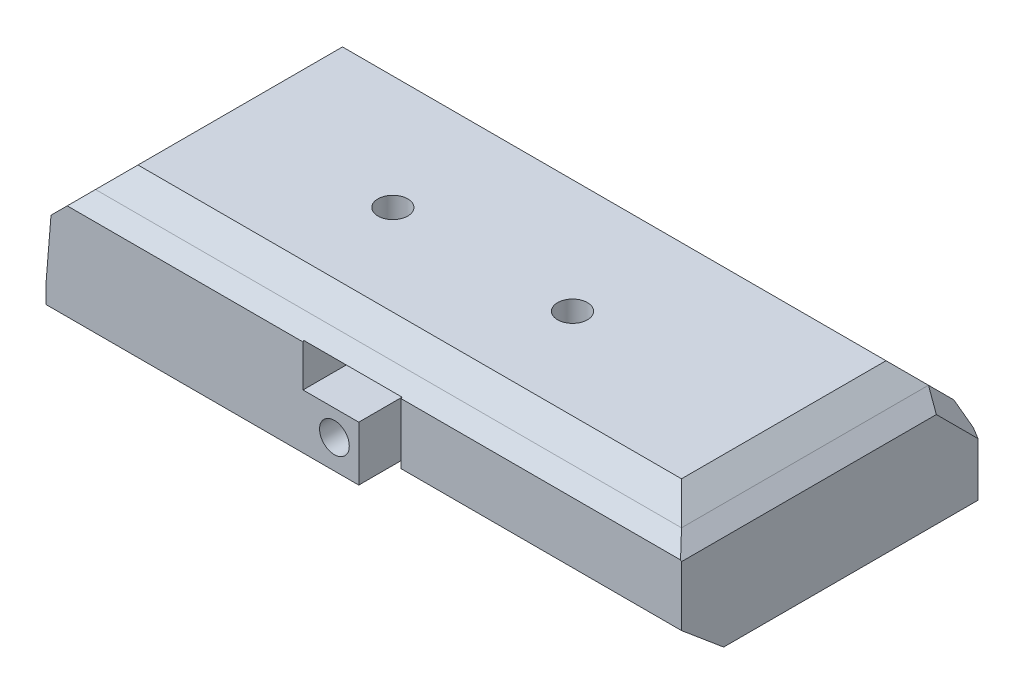
ISO-10303-21;
HEADER;
FILE_DESCRIPTION(('STEP AP214'),'2;1');
FILE_NAME('part.step','',(''),(''),'','','');
FILE_SCHEMA(('AUTOMOTIVE_DESIGN { 1 0 10303 214 1 1 1 1 }'));
ENDSEC;
DATA;
#1=APPLICATION_CONTEXT('core data for automotive mechanical design processes');
#2=APPLICATION_PROTOCOL_DEFINITION('international standard','automotive_design',2000,#1);
#3=PRODUCT_CONTEXT('',#1,'mechanical');
#4=PRODUCT('Part','Part','',(#3));
#5=PRODUCT_RELATED_PRODUCT_CATEGORY('part','',(#4));
#6=PRODUCT_DEFINITION_FORMATION('','',#4);
#7=PRODUCT_DEFINITION_CONTEXT('part definition',#1,'design');
#8=PRODUCT_DEFINITION('design','',#6,#7);
#9=PRODUCT_DEFINITION_SHAPE('','',#8);
#10=(LENGTH_UNIT() NAMED_UNIT(*) SI_UNIT(.MILLI.,.METRE.));
#11=(NAMED_UNIT(*) PLANE_ANGLE_UNIT() SI_UNIT($,.RADIAN.));
#12=(NAMED_UNIT(*) SI_UNIT($,.STERADIAN.) SOLID_ANGLE_UNIT());
#13=UNCERTAINTY_MEASURE_WITH_UNIT(LENGTH_MEASURE(1.E-05),#10,'distance_accuracy_value','');
#14=(GEOMETRIC_REPRESENTATION_CONTEXT(3) GLOBAL_UNCERTAINTY_ASSIGNED_CONTEXT((#13)) GLOBAL_UNIT_ASSIGNED_CONTEXT((#10,
#11,#12)) REPRESENTATION_CONTEXT('',''));
#15=CARTESIAN_POINT('',(0.,0.,0.));
#16=DIRECTION('',(0.,0.,1.));
#17=DIRECTION('',(1.,0.,0.));
#18=AXIS2_PLACEMENT_3D('',#15,#16,#17);
#19=CARTESIAN_POINT('',(-5.23271255306533,8.20599999999992,10.3226904858506));
#20=DIRECTION('',(0.,0.,-1.));
#21=DIRECTION('',(-1.,0.,0.));
#22=AXIS2_PLACEMENT_3D('',#19,#20,#21);
#23=PLANE('',#22);
#24=DIRECTION('',(-1.,0.,0.));
#25=VECTOR('',#24,1.);
#26=CARTESIAN_POINT('',(-0.232712553065327,13.5826195303939,10.3226904858506));
#27=LINE('',#26,#25);
#28=CARTESIAN_POINT('',(84.461180425117,13.5826195303939,10.3226904858506));
#29=VERTEX_POINT('',#28);
#30=CARTESIAN_POINT('',(44.97731631751,13.5826195303939,10.3226904858506));
#31=VERTEX_POINT('',#30);
#32=EDGE_CURVE('E273',#29,#31,#27,.T.);
#33=ORIENTED_EDGE('',*,*,#32,.T.);
#34=DIRECTION('',(0.,1.,0.));
#35=VECTOR('',#34,1.);
#36=CARTESIAN_POINT('',(44.97731631751,13.7059999999999,10.3226904858506));
#37=LINE('',#36,#35);
#38=CARTESIAN_POINT('',(44.97731631751,4.99999999999989,10.3226904858506));
#39=VERTEX_POINT('',#38);
#40=EDGE_CURVE('E438',#39,#31,#37,.T.);
#41=ORIENTED_EDGE('',*,*,#40,.F.);
#42=DIRECTION('',(1.,0.,0.));
#43=VECTOR('',#42,1.);
#44=CARTESIAN_POINT('',(-5.23271255306533,4.99999999999989,10.3226904858506));
#45=LINE('',#44,#43);
#46=CARTESIAN_POINT('',(84.5961502528417,4.99999999999989,10.3226904858506));
#47=VERTEX_POINT('',#46);
#48=EDGE_CURVE('E264',#39,#47,#45,.T.);
#49=ORIENTED_EDGE('',*,*,#48,.T.);
#50=DIRECTION('',(0.,-1.,0.));
#51=VECTOR('',#50,1.);
#52=CARTESIAN_POINT('',(84.5961502528417,15.5826195303939,10.3226904858506));
#53=LINE('',#52,#51);
#54=CARTESIAN_POINT('',(84.5961502528417,13.4378821103445,10.3226904858506));
#55=VERTEX_POINT('',#54);
#56=EDGE_CURVE('E367',#55,#47,#53,.T.);
#57=ORIENTED_EDGE('',*,*,#56,.F.);
#58=DIRECTION('',(-0.681998360062499,0.73135370161917,0.));
#59=VECTOR('',#58,1.);
#60=CARTESIAN_POINT('',(84.5961502528417,13.4378821103445,10.3226904858506));
#61=LINE('',#60,#59);
#62=EDGE_CURVE('E304',#55,#29,#61,.T.);
#63=ORIENTED_EDGE('',*,*,#62,.T.);
#64=EDGE_LOOP('',(#33,#41,#49,#57,#63));
#65=FACE_BOUND('',#64,.T.);
#66=ADVANCED_FACE('F43',(#65),#23,.F.);
#67=CARTESIAN_POINT('',(-0.232712553065326,15.5826195303939,0.));
#68=DIRECTION('',(-0.707106781186549,0.707106781186547,0.));
#69=DIRECTION('',(0.,0.,-1.));
#70=AXIS2_PLACEMENT_3D('',#67,#68,#69);
#71=PLANE('',#70);
#72=DIRECTION('',(-0.707106781186547,-0.707106781186549,0.));
#73=VECTOR('',#72,1.);
#74=CARTESIAN_POINT('',(-0.232712553065326,15.5826195303939,10.3226904858506));
#75=LINE('',#74,#73);
#76=CARTESIAN_POINT('',(-2.23271255306532,13.5826195303939,10.3226904858506));
#77=VERTEX_POINT('',#76);
#78=CARTESIAN_POINT('',(-4.52560577187878,11.2897263115804,10.3226904858506));
#79=VERTEX_POINT('',#78);
#80=EDGE_CURVE('E207',#77,#79,#75,.T.);
#81=ORIENTED_EDGE('',*,*,#80,.F.);
#82=DIRECTION('',(0.577350269189625,0.577350269189626,-0.577350269189626));
#83=VECTOR('',#82,1.);
#84=CARTESIAN_POINT('',(2.54151760888489,18.3568496923441,5.54846032390043));
#85=LINE('',#84,#83);
#86=CARTESIAN_POINT('',(-0.232712553065326,15.5826195303939,8.32269048585064));
#87=VERTEX_POINT('',#86);
#88=EDGE_CURVE('E204',#77,#87,#85,.T.);
#89=ORIENTED_EDGE('',*,*,#88,.T.);
#90=DIRECTION('',(0.,0.,1.));
#91=VECTOR('',#90,1.);
#92=CARTESIAN_POINT('',(-0.232712553065326,15.5826195303939,10.3226904858506));
#93=LINE('',#92,#91);
#94=CARTESIAN_POINT('',(-0.232712553065327,15.5826195303939,-26.5873095141492));
#95=VERTEX_POINT('',#94);
#96=EDGE_CURVE('E197',#95,#87,#93,.T.);
#97=ORIENTED_EDGE('',*,*,#96,.F.);
#98=DIRECTION('',(0.577350269189623,0.577350269189624,0.57735026918963));
#99=VECTOR('',#98,1.);
#100=CARTESIAN_POINT('',(-0.155141702043552,15.6601903814157,-26.5097386631275));
#101=LINE('',#100,#99);
#102=CARTESIAN_POINT('',(-2.55714017870718,13.2581919047521,-28.9117371397911));
#103=VERTEX_POINT('',#102);
#104=EDGE_CURVE('E202',#103,#95,#101,.T.);
#105=ORIENTED_EDGE('',*,*,#104,.F.);
#106=DIRECTION('',(0.681235920666489,0.681235920666491,0.268020970797735));
#107=VECTOR('',#106,1.);
#108=CARTESIAN_POINT('',(4.87917598034183,20.6945080638011,-25.9860419207879));
#109=LINE('',#108,#107);
#110=CARTESIAN_POINT('',(-5.23271255306533,10.5826195303939,-29.9643967008335));
#111=VERTEX_POINT('',#110);
#112=EDGE_CURVE('E220',#111,#103,#109,.T.);
#113=ORIENTED_EDGE('',*,*,#112,.F.);
#114=DIRECTION('',(0.,0.,-1.));
#115=VECTOR('',#114,1.);
#116=CARTESIAN_POINT('',(-5.23271255306533,10.5826195303939,-26.5873095141492));
#117=LINE('',#116,#115);
#118=CARTESIAN_POINT('',(-5.23271255306531,10.5826195303939,-0.677309514149018));
#119=VERTEX_POINT('',#118);
#120=EDGE_CURVE('E333',#119,#111,#117,.T.);
#121=ORIENTED_EDGE('',*,*,#120,.F.);
#122=DIRECTION('',(0.0640184399664479,0.0640184399664481,0.995893206467704));
#123=VECTOR('',#122,1.);
#124=CARTESIAN_POINT('',(-5.14854671983099,10.6667853636282,0.632003577183369));
#125=LINE('',#124,#123);
#126=EDGE_CURVE('E321',#119,#79,#125,.T.);
#127=ORIENTED_EDGE('',*,*,#126,.T.);
#128=EDGE_LOOP('',(#81,#89,#97,#105,#113,#121,#127));
#129=FACE_BOUND('',#128,.T.);
#130=ADVANCED_FACE('F200',(#129),#71,.T.);
#131=CARTESIAN_POINT('',(-5.23271255306533,8.20599999999992,-31.5873095141493));
#132=DIRECTION('',(1.,0.,0.));
#133=DIRECTION('',(0.,0.,-1.));
#134=AXIS2_PLACEMENT_3D('',#131,#132,#133);
#135=PLANE('',#134);
#136=DIRECTION('',(0.,-0.588171697675046,0.808736084303189));
#137=VECTOR('',#136,1.);
#138=CARTESIAN_POINT('',(-5.23271255306533,24.4635727739333,-19.763620224016));
#139=LINE('',#138,#137);
#140=CARTESIAN_POINT('',(-5.23271255306533,2.5826195303939,10.3226904858506));
#141=VERTEX_POINT('',#140);
#142=EDGE_CURVE('E219',#119,#141,#139,.T.);
#143=ORIENTED_EDGE('',*,*,#142,.F.);
#144=ORIENTED_EDGE('',*,*,#120,.T.);
#145=DIRECTION('',(0.,-0.879548109367855,-0.475809965540268));
#146=VECTOR('',#145,1.);
#147=CARTESIAN_POINT('',(-5.23271255306533,8.06486970171601,-31.3264261867285));
#148=LINE('',#147,#146);
#149=CARTESIAN_POINT('',(-5.23271255306533,7.58261953039386,-31.5873095141493));
#150=VERTEX_POINT('',#149);
#151=EDGE_CURVE('E340',#111,#150,#148,.T.);
#152=ORIENTED_EDGE('',*,*,#151,.T.);
#153=DIRECTION('',(0.,-1.,0.));
#154=VECTOR('',#153,1.);
#155=CARTESIAN_POINT('',(-5.23271255306533,8.20599999999992,-31.5873095141493));
#156=LINE('',#155,#154);
#157=CARTESIAN_POINT('',(-5.23271255306533,0.,-31.5873095141493));
#158=VERTEX_POINT('',#157);
#159=EDGE_CURVE('E227',#150,#158,#156,.T.);
#160=ORIENTED_EDGE('',*,*,#159,.T.);
#161=DIRECTION('',(0.,0.,1.));
#162=VECTOR('',#161,1.);
#163=CARTESIAN_POINT('',(-5.23271255306533,0.,-31.5873095141493));
#164=LINE('',#163,#162);
#165=CARTESIAN_POINT('',(-5.23271255306533,0.,10.3226904858506));
#166=VERTEX_POINT('',#165);
#167=EDGE_CURVE('E356',#158,#166,#164,.T.);
#168=ORIENTED_EDGE('',*,*,#167,.T.);
#169=DIRECTION('',(0.,-1.,0.));
#170=VECTOR('',#169,1.);
#171=CARTESIAN_POINT('',(-5.23271255306533,8.20599999999992,10.3226904858506));
#172=LINE('',#171,#170);
#173=EDGE_CURVE('E353',#141,#166,#172,.T.);
#174=ORIENTED_EDGE('',*,*,#173,.F.);
#175=EDGE_LOOP('',(#143,#144,#152,#160,#168,#174));
#176=FACE_BOUND('',#175,.T.);
#177=ADVANCED_FACE('F497',(#176),#135,.F.);
#178=CARTESIAN_POINT('',(39.47731631751,8.20599999999992,-31.5873095141493));
#179=DIRECTION('',(0.,0.,1.));
#180=DIRECTION('',(1.,0.,0.));
#181=AXIS2_PLACEMENT_3D('',#178,#179,#180);
#182=PLANE('',#181);
#183=DIRECTION('',(1.,0.,0.));
#184=VECTOR('',#183,1.);
#185=CARTESIAN_POINT('',(84.5961502528417,10.5826195303939,-31.5873095141493));
#186=LINE('',#185,#184);
#187=CARTESIAN_POINT('',(5.76728744693472,10.5826195303939,-31.5873095141493));
#188=VERTEX_POINT('',#187);
#189=CARTESIAN_POINT('',(31.0961502528417,10.5826195303939,-31.5873095141493));
#190=VERTEX_POINT('',#189);
#191=EDGE_CURVE('E226',#188,#190,#186,.T.);
#192=ORIENTED_EDGE('',*,*,#191,.T.);
#193=DIRECTION('',(0.,-1.,0.));
#194=VECTOR('',#193,1.);
#195=CARTESIAN_POINT('',(31.0961502528417,13.7059999999999,-31.5873095141493));
#196=LINE('',#195,#194);
#197=CARTESIAN_POINT('',(31.0961502528417,7.70599999999992,-31.5873095141493));
#198=VERTEX_POINT('',#197);
#199=EDGE_CURVE('E416',#190,#198,#196,.T.);
#200=ORIENTED_EDGE('',*,*,#199,.T.);
#201=DIRECTION('',(1.,0.,0.));
#202=VECTOR('',#201,1.);
#203=CARTESIAN_POINT('',(31.0961502528417,7.70599999999992,-31.5873095141493));
#204=LINE('',#203,#202);
#205=CARTESIAN_POINT('',(38.9773163175099,7.70599999999992,-31.5873095141493));
#206=VERTEX_POINT('',#205);
#207=EDGE_CURVE('E437',#198,#206,#204,.T.);
#208=ORIENTED_EDGE('',*,*,#207,.T.);
#209=DIRECTION('',(0.,-1.,0.));
#210=VECTOR('',#209,1.);
#211=CARTESIAN_POINT('',(38.9773163175099,7.70599999999992,-31.5873095141493));
#212=LINE('',#211,#210);
#213=CARTESIAN_POINT('',(38.9773163175099,0.,-31.5873095141493));
#214=VERTEX_POINT('',#213);
#215=EDGE_CURVE('E456',#206,#214,#212,.T.);
#216=ORIENTED_EDGE('',*,*,#215,.T.);
#217=DIRECTION('',(-1.,0.,0.));
#218=VECTOR('',#217,1.);
#219=CARTESIAN_POINT('',(39.47731631751,0.,-31.5873095141493));
#220=LINE('',#219,#218);
#221=EDGE_CURVE('E360',#214,#158,#220,.T.);
#222=ORIENTED_EDGE('',*,*,#221,.T.);
#223=ORIENTED_EDGE('',*,*,#159,.F.);
#224=DIRECTION('',(0.964763821237732,0.263117405792109,0.));
#225=VECTOR('',#224,1.);
#226=CARTESIAN_POINT('',(36.5402493610624,18.9752455069742,-31.5873095141493));
#227=LINE('',#226,#225);
#228=EDGE_CURVE('E343',#150,#188,#227,.T.);
#229=ORIENTED_EDGE('',*,*,#228,.T.);
#230=EDGE_LOOP('',(#192,#200,#208,#216,#222,#223,#229));
#231=FACE_BOUND('',#230,.T.);
#232=CARTESIAN_POINT('',(35.5367332851758,4.10299999999993,-31.5873095141493));
#233=DIRECTION('',(0.,0.,1.));
#234=DIRECTION('',(1.,0.,0.));
#235=AXIS2_PLACEMENT_3D('',#232,#233,#234);
#236=CIRCLE('',#235,2.1);
#237=CARTESIAN_POINT('',(37.6367332851758,4.10299999999993,-31.5873095141493));
#238=VERTEX_POINT('',#237);
#239=EDGE_CURVE('E300',#238,#238,#236,.T.);
#240=ORIENTED_EDGE('',*,*,#239,.T.);
#241=EDGE_LOOP('',(#240));
#242=FACE_BOUND('',#241,.T.);
#243=ADVANCED_FACE('F503',(#231,#242),#182,.F.);
#244=CARTESIAN_POINT('',(35.5367332851758,4.10299999999993,10.3226904858506));
#245=DIRECTION('',(0.,0.,1.));
#246=DIRECTION('',(1.,0.,0.));
#247=AXIS2_PLACEMENT_3D('',#244,#245,#246);
#248=CIRCLE('',#247,2.1);
#249=CARTESIAN_POINT('',(37.6367332851758,4.10299999999993,10.3226904858506));
#250=VERTEX_POINT('',#249);
#251=EDGE_CURVE('E392',#250,#250,#248,.T.);
#252=ORIENTED_EDGE('',*,*,#251,.F.);
#253=EDGE_LOOP('',(#252));
#254=FACE_BOUND('',#253,.T.);
#255=DIRECTION('',(1.,0.,0.));
#256=VECTOR('',#255,1.);
#257=CARTESIAN_POINT('',(31.5961502528417,7.70599999999992,10.3226904858506));
#258=LINE('',#257,#256);
#259=CARTESIAN_POINT('',(31.0961502528417,7.70599999999992,10.3226904858506));
#260=VERTEX_POINT('',#259);
#261=CARTESIAN_POINT('',(38.9773163175099,7.70599999999992,10.3226904858506));
#262=VERTEX_POINT('',#261);
#263=EDGE_CURVE('E444',#260,#262,#258,.T.);
#264=ORIENTED_EDGE('',*,*,#263,.F.);
#265=DIRECTION('',(0.,-1.,0.));
#266=VECTOR('',#265,1.);
#267=CARTESIAN_POINT('',(31.0961502528417,13.2059999999999,10.3226904858506));
#268=LINE('',#267,#266);
#269=CARTESIAN_POINT('',(31.0961502528417,13.5826195303939,10.3226904858506));
#270=VERTEX_POINT('',#269);
#271=EDGE_CURVE('E434',#270,#260,#268,.T.);
#272=ORIENTED_EDGE('',*,*,#271,.F.);
#273=EDGE_CURVE('E277',#270,#77,#27,.T.);
#274=ORIENTED_EDGE('',*,*,#273,.T.);
#275=ORIENTED_EDGE('',*,*,#80,.T.);
#276=DIRECTION('',(0.0809438249334175,0.996718665022958,0.));
#277=VECTOR('',#276,1.);
#278=CARTESIAN_POINT('',(-4.77902822004321,8.16915615778459,10.3226904858506));
#279=LINE('',#278,#277);
#280=EDGE_CURVE('E325',#141,#79,#279,.T.);
#281=ORIENTED_EDGE('',*,*,#280,.F.);
#282=ORIENTED_EDGE('',*,*,#173,.T.);
#283=DIRECTION('',(1.,0.,0.));
#284=VECTOR('',#283,1.);
#285=CARTESIAN_POINT('',(-5.23271255306533,0.,10.3226904858506));
#286=LINE('',#285,#284);
#287=CARTESIAN_POINT('',(38.9773163175099,0.,10.3226904858506));
#288=VERTEX_POINT('',#287);
#289=EDGE_CURVE('E363',#166,#288,#286,.T.);
#290=ORIENTED_EDGE('',*,*,#289,.T.);
#291=DIRECTION('',(0.,-1.,0.));
#292=VECTOR('',#291,1.);
#293=CARTESIAN_POINT('',(38.9773163175099,7.70599999999992,10.3226904858506));
#294=LINE('',#293,#292);
#295=EDGE_CURVE('E441',#262,#288,#294,.T.);
#296=ORIENTED_EDGE('',*,*,#295,.F.);
#297=EDGE_LOOP('',(#264,#272,#274,#275,#281,#282,#290,#296));
#298=FACE_BOUND('',#297,.T.);
#299=ADVANCED_FACE('F493',(#254,#298),#23,.F.);
#300=DIRECTION('',(1.,0.,0.));
#301=VECTOR('',#300,1.);
#302=CARTESIAN_POINT('',(84.5961502528417,-1.14491749414469E-13,-31.5873095141493));
#303=LINE('',#302,#301);
#304=CARTESIAN_POINT('',(44.97731631751,-1.14491749414469E-13,-31.5873095141493));
#305=VERTEX_POINT('',#304);
#306=CARTESIAN_POINT('',(84.5961502528417,-1.14491749414469E-13,-31.5873095141493));
#307=VERTEX_POINT('',#306);
#308=EDGE_CURVE('E375',#305,#307,#303,.T.);
#309=ORIENTED_EDGE('',*,*,#308,.F.);
#310=DIRECTION('',(0.,1.,0.));
#311=VECTOR('',#310,1.);
#312=CARTESIAN_POINT('',(44.97731631751,13.5826195303939,-31.5873095141493));
#313=LINE('',#312,#311);
#314=CARTESIAN_POINT('',(44.97731631751,8.58261953039384,-31.5873095141493));
#315=VERTEX_POINT('',#314);
#316=EDGE_CURVE('E452',#305,#315,#313,.T.);
#317=ORIENTED_EDGE('',*,*,#316,.T.);
#318=DIRECTION('',(1.,0.,0.));
#319=VECTOR('',#318,1.);
#320=CARTESIAN_POINT('',(82.5961502528417,8.58261953039384,-31.5873095141493));
#321=LINE('',#320,#319);
#322=CARTESIAN_POINT('',(83.9149257347751,8.58261953039385,-31.5873095141493));
#323=VERTEX_POINT('',#322);
#324=EDGE_CURVE('E292',#315,#323,#321,.T.);
#325=ORIENTED_EDGE('',*,*,#324,.T.);
#326=DIRECTION('',(0.550486111273608,-0.834844321592272,0.));
#327=VECTOR('',#326,1.);
#328=CARTESIAN_POINT('',(79.072620379973,15.9262582636572,-31.5873095141493));
#329=LINE('',#328,#327);
#330=CARTESIAN_POINT('',(84.5961502528417,7.54950278323098,-31.5873095141493));
#331=VERTEX_POINT('',#330);
#332=EDGE_CURVE('E308',#323,#331,#329,.T.);
#333=ORIENTED_EDGE('',*,*,#332,.T.);
#334=DIRECTION('',(0.,1.,0.));
#335=VECTOR('',#334,1.);
#336=CARTESIAN_POINT('',(84.5961502528417,15.5826195303939,-31.5873095141493));
#337=LINE('',#336,#335);
#338=EDGE_CURVE('E371',#307,#331,#337,.T.);
#339=ORIENTED_EDGE('',*,*,#338,.F.);
#340=EDGE_LOOP('',(#309,#317,#325,#333,#339));
#341=FACE_BOUND('',#340,.T.);
#342=ADVANCED_FACE('F502',(#341),#182,.F.);
#343=CARTESIAN_POINT('',(0.,0.,0.));
#344=DIRECTION('',(0.,-1.,0.));
#345=DIRECTION('',(0.,0.,-1.));
#346=AXIS2_PLACEMENT_3D('',#343,#344,#345);
#347=PLANE('',#346);
#348=DIRECTION('',(0.,0.,1.));
#349=VECTOR('',#348,1.);
#350=CARTESIAN_POINT('',(38.9773163175099,0.,-31.5873095141493));
#351=LINE('',#350,#349);
#352=EDGE_CURVE('E415',#214,#288,#351,.T.);
#353=ORIENTED_EDGE('',*,*,#352,.T.);
#354=ORIENTED_EDGE('',*,*,#289,.F.);
#355=ORIENTED_EDGE('',*,*,#167,.F.);
#356=ORIENTED_EDGE('',*,*,#221,.F.);
#357=EDGE_LOOP('',(#353,#354,#355,#356));
#358=FACE_BOUND('',#357,.T.);
#359=ADVANCED_FACE('F509',(#358),#347,.T.);
#360=CARTESIAN_POINT('',(84.5961502528417,0.,0.));
#361=DIRECTION('',(-1.,0.,0.));
#362=DIRECTION('',(0.,0.,1.));
#363=AXIS2_PLACEMENT_3D('',#360,#361,#362);
#364=PLANE('',#363);
#365=ORIENTED_EDGE('',*,*,#56,.T.);
#366=DIRECTION('',(0.,0.64278760968654,0.766044443118977));
#367=VECTOR('',#366,1.);
#368=CARTESIAN_POINT('',(84.5961502528417,-1.14491749414469E-13,4.36392252287961));
#369=LINE('',#368,#367);
#370=CARTESIAN_POINT('',(84.5961502528417,-1.14491749414469E-13,4.36392252287961));
#371=VERTEX_POINT('',#370);
#372=EDGE_CURVE('E261',#47,#371,#369,.F.);
#373=ORIENTED_EDGE('',*,*,#372,.T.);
#374=DIRECTION('',(0.,0.,1.));
#375=VECTOR('',#374,1.);
#376=CARTESIAN_POINT('',(84.5961502528417,-1.14491749414469E-13,10.3226904858506));
#377=LINE('',#376,#375);
#378=EDGE_CURVE('E378',#307,#371,#377,.T.);
#379=ORIENTED_EDGE('',*,*,#378,.F.);
#380=ORIENTED_EDGE('',*,*,#338,.T.);
#381=DIRECTION('',(0.,0.707106781186544,0.707106781186551));
#382=VECTOR('',#381,1.);
#383=CARTESIAN_POINT('',(84.5961502528417,14.0660611568124,-25.0707511405678));
#384=LINE('',#383,#382);
#385=CARTESIAN_POINT('',(84.5961502528417,13.4378821103445,-25.6989301870357));
#386=VERTEX_POINT('',#385);
#387=EDGE_CURVE('E314',#331,#386,#384,.T.);
#388=ORIENTED_EDGE('',*,*,#387,.T.);
#389=DIRECTION('',(0.,0.,1.));
#390=VECTOR('',#389,1.);
#391=CARTESIAN_POINT('',(84.5961502528417,13.4378821103445,10.3226904858506));
#392=LINE('',#391,#390);
#393=EDGE_CURVE('E318',#386,#55,#392,.T.);
#394=ORIENTED_EDGE('',*,*,#393,.T.);
#395=EDGE_LOOP('',(#365,#373,#379,#380,#388,#394));
#396=FACE_BOUND('',#395,.T.);
#397=ADVANCED_FACE('F575',(#396),#364,.F.);
#398=CARTESIAN_POINT('',(0.,-1.14491749414469E-13,0.));
#399=DIRECTION('',(0.,1.,0.));
#400=DIRECTION('',(0.,0.,1.));
#401=AXIS2_PLACEMENT_3D('',#398,#399,#400);
#402=PLANE('',#401);
#403=DIRECTION('',(-1.,0.,0.));
#404=VECTOR('',#403,1.);
#405=CARTESIAN_POINT('',(0.,-1.14491749414469E-13,4.36392252287961));
#406=LINE('',#405,#404);
#407=CARTESIAN_POINT('',(44.97731631751,-1.14491749414469E-13,4.36392252287961));
#408=VERTEX_POINT('',#407);
#409=EDGE_CURVE('E267',#371,#408,#406,.T.);
#410=ORIENTED_EDGE('',*,*,#409,.T.);
#411=DIRECTION('',(0.,0.,1.));
#412=VECTOR('',#411,1.);
#413=CARTESIAN_POINT('',(44.97731631751,-1.14491749414469E-13,-31.5873095141493));
#414=LINE('',#413,#412);
#415=EDGE_CURVE('E420',#305,#408,#414,.T.);
#416=ORIENTED_EDGE('',*,*,#415,.F.);
#417=ORIENTED_EDGE('',*,*,#308,.T.);
#418=ORIENTED_EDGE('',*,*,#378,.T.);
#419=EDGE_LOOP('',(#410,#416,#417,#418));
#420=FACE_BOUND('',#419,.T.);
#421=ADVANCED_FACE('F564',(#420),#402,.F.);
#422=CARTESIAN_POINT('',(0.,15.5826195303939,-26.5873095141492));
#423=DIRECTION('',(0.,0.707106781186551,-0.707106781186544));
#424=DIRECTION('',(1.,0.,0.));
#425=AXIS2_PLACEMENT_3D('',#422,#423,#424);
#426=PLANE('',#425);
#427=DIRECTION('',(0.,0.707106781186544,0.707106781186551));
#428=VECTOR('',#427,1.);
#429=CARTESIAN_POINT('',(31.0961502528417,15.5826195303939,-26.5873095141492));
#430=LINE('',#429,#428);
#431=CARTESIAN_POINT('',(31.0961502528417,13.7059999999999,-28.4639290445432));
#432=VERTEX_POINT('',#431);
#433=EDGE_CURVE('E396',#190,#432,#430,.T.);
#434=ORIENTED_EDGE('',*,*,#433,.F.);
#435=ORIENTED_EDGE('',*,*,#191,.F.);
#436=DIRECTION('',(0.910366477462605,-0.292602867990325,-0.292602867990328));
#437=VECTOR('',#436,1.);
#438=CARTESIAN_POINT('',(-1.67620920191259,12.9750499650026,-29.1948790795405));
#439=LINE('',#438,#437);
#440=EDGE_CURVE('E208',#103,#188,#439,.T.);
#441=ORIENTED_EDGE('',*,*,#440,.F.);
#442=ORIENTED_EDGE('',*,*,#104,.T.);
#443=DIRECTION('',(-1.,0.,0.));
#444=VECTOR('',#443,1.);
#445=CARTESIAN_POINT('',(-5.23271255306533,15.5826195303939,-26.5873095141492));
#446=LINE('',#445,#444);
#447=CARTESIAN_POINT('',(82.5961502528417,15.5826195303939,-26.5873095141492));
#448=VERTEX_POINT('',#447);
#449=EDGE_CURVE('E215',#448,#95,#446,.T.);
#450=ORIENTED_EDGE('',*,*,#449,.F.);
#451=DIRECTION('',(0.,-0.707106781186544,-0.707106781186551));
#452=VECTOR('',#451,1.);
#453=CARTESIAN_POINT('',(82.5961502528417,10.5826195303939,-31.5873095141493));
#454=LINE('',#453,#452);
#455=CARTESIAN_POINT('',(82.5961502528417,11.996833092767,-30.1730959517762));
#456=VERTEX_POINT('',#455);
#457=EDGE_CURVE('E311',#448,#456,#454,.T.);
#458=ORIENTED_EDGE('',*,*,#457,.T.);
#459=DIRECTION('',(-1.,0.,0.));
#460=VECTOR('',#459,1.);
#461=CARTESIAN_POINT('',(44.47731631751,11.996833092767,-30.1730959517762));
#462=LINE('',#461,#460);
#463=CARTESIAN_POINT('',(44.97731631751,11.996833092767,-30.1730959517762));
#464=VERTEX_POINT('',#463);
#465=EDGE_CURVE('E285',#456,#464,#462,.T.);
#466=ORIENTED_EDGE('',*,*,#465,.T.);
#467=DIRECTION('',(0.,-0.707106781186544,-0.707106781186551));
#468=VECTOR('',#467,1.);
#469=CARTESIAN_POINT('',(44.97731631751,15.5826195303939,-26.5873095141492));
#470=LINE('',#469,#468);
#471=CARTESIAN_POINT('',(44.97731631751,13.7059999999999,-28.4639290445432));
#472=VERTEX_POINT('',#471);
#473=EDGE_CURVE('E402',#472,#464,#470,.T.);
#474=ORIENTED_EDGE('',*,*,#473,.F.);
#475=DIRECTION('',(1.,0.,0.));
#476=VECTOR('',#475,1.);
#477=CARTESIAN_POINT('',(0.,13.7059999999999,-28.4639290445432));
#478=LINE('',#477,#476);
#479=EDGE_CURVE('E399',#432,#472,#478,.T.);
#480=ORIENTED_EDGE('',*,*,#479,.F.);
#481=EDGE_LOOP('',(#434,#435,#441,#442,#450,#458,#466,#474,#480));
#482=FACE_BOUND('',#481,.T.);
#483=ADVANCED_FACE('F213',(#482),#426,.T.);
#484=CARTESIAN_POINT('',(-4.09262185179003,15.0062801232301,-27.739531045855));
#485=DIRECTION('',(0.128687374509461,-0.47185370653469,0.872234853277107));
#486=DIRECTION('',(0.,-0.879548109367855,-0.475809965540268));
#487=AXIS2_PLACEMENT_3D('',#484,#485,#486);
#488=PLANE('',#487);
#489=ORIENTED_EDGE('',*,*,#151,.F.);
#490=ORIENTED_EDGE('',*,*,#112,.T.);
#491=ORIENTED_EDGE('',*,*,#440,.T.);
#492=ORIENTED_EDGE('',*,*,#228,.F.);
#493=EDGE_LOOP('',(#489,#490,#491,#492));
#494=FACE_BOUND('',#493,.T.);
#495=ADVANCED_FACE('F643',(#494),#488,.F.);
#496=CARTESIAN_POINT('',(-5.99170997790702,0.486588583642452,0.353882606285419));
#497=DIRECTION('',(-0.994996091934585,0.0808039342507271,0.0587664976368924));
#498=DIRECTION('',(-0.0809438249334175,-0.996718665022958,0.));
#499=AXIS2_PLACEMENT_3D('',#496,#497,#498);
#500=PLANE('',#499);
#501=ORIENTED_EDGE('',*,*,#126,.F.);
#502=ORIENTED_EDGE('',*,*,#142,.T.);
#503=ORIENTED_EDGE('',*,*,#280,.T.);
#504=EDGE_LOOP('',(#501,#502,#503));
#505=FACE_BOUND('',#504,.T.);
#506=ADVANCED_FACE('F533',(#505),#500,.T.);
#507=CARTESIAN_POINT('',(84.5961502528417,13.4378821103445,0.));
#508=DIRECTION('',(0.73135370161917,0.681998360062499,0.));
#509=DIRECTION('',(0.,0.,-1.));
#510=AXIS2_PLACEMENT_3D('',#507,#508,#509);
#511=PLANE('',#510);
#512=DIRECTION('',(0.,0.,-1.));
#513=VECTOR('',#512,1.);
#514=CARTESIAN_POINT('',(82.5961502528417,15.5826195303939,-26.5873095141492));
#515=LINE('',#514,#513);
#516=CARTESIAN_POINT('',(82.5961502528417,15.5826195303939,8.32269048585064));
#517=VERTEX_POINT('',#516);
#518=EDGE_CURVE('E295',#517,#448,#515,.T.);
#519=ORIENTED_EDGE('',*,*,#518,.F.);
#520=DIRECTION('',(0.550486111273606,-0.59032408103298,0.59032408103298));
#521=VECTOR('',#520,1.);
#522=CARTESIAN_POINT('',(81.1946003686984,17.0855977716878,6.81971224455672));
#523=LINE('',#522,#521);
#524=EDGE_CURVE('E278',#517,#29,#523,.T.);
#525=ORIENTED_EDGE('',*,*,#524,.T.);
#526=ORIENTED_EDGE('',*,*,#62,.F.);
#527=ORIENTED_EDGE('',*,*,#393,.F.);
#528=DIRECTION('',(-0.652706042705535,0.699941537041448,-0.289925277510836));
#529=VECTOR('',#528,1.);
#530=CARTESIAN_POINT('',(89.4593125062415,8.22277907802546,-23.5387637818761));
#531=LINE('',#530,#529);
#532=EDGE_CURVE('E296',#448,#386,#531,.F.);
#533=ORIENTED_EDGE('',*,*,#532,.F.);
#534=EDGE_LOOP('',(#519,#525,#526,#527,#533));
#535=FACE_BOUND('',#534,.T.);
#536=ADVANCED_FACE('F581',(#535),#511,.T.);
#537=CARTESIAN_POINT('',(84.5961502528417,19.5684061486902,-19.56840614869));
#538=DIRECTION('',(0.73135370161917,0.4822456651583,-0.482245665158295));
#539=DIRECTION('',(0.,-0.707106781186544,-0.707106781186551));
#540=AXIS2_PLACEMENT_3D('',#537,#538,#539);
#541=PLANE('',#540);
#542=ORIENTED_EDGE('',*,*,#332,.F.);
#543=DIRECTION('',(-0.336098510997103,0.870134537880081,0.360421526679176));
#544=VECTOR('',#543,1.);
#545=CARTESIAN_POINT('',(79.323139368805,20.4704196153871,-26.6632214921651));
#546=LINE('',#545,#544);
#547=EDGE_CURVE('E289',#323,#456,#546,.T.);
#548=ORIENTED_EDGE('',*,*,#547,.T.);
#549=ORIENTED_EDGE('',*,*,#457,.F.);
#550=ORIENTED_EDGE('',*,*,#532,.T.);
#551=ORIENTED_EDGE('',*,*,#387,.F.);
#552=EDGE_LOOP('',(#542,#548,#549,#550,#551));
#553=FACE_BOUND('',#552,.T.);
#554=ADVANCED_FACE('F626',(#553),#541,.T.);
#555=CARTESIAN_POINT('',(39.47731631751,8.58261953039384,-31.5873095141493));
#556=DIRECTION('',(0.,0.382683432365091,-0.923879532511286));
#557=DIRECTION('',(-1.,0.,0.));
#558=AXIS2_PLACEMENT_3D('',#555,#556,#557);
#559=PLANE('',#558);
#560=DIRECTION('',(0.,-0.923879532511287,-0.382683432365091));
#561=VECTOR('',#560,1.);
#562=CARTESIAN_POINT('',(44.97731631751,8.58261953039384,-31.5873095141493));
#563=LINE('',#562,#561);
#564=EDGE_CURVE('E405',#464,#315,#563,.T.);
#565=ORIENTED_EDGE('',*,*,#564,.F.);
#566=ORIENTED_EDGE('',*,*,#465,.F.);
#567=ORIENTED_EDGE('',*,*,#547,.F.);
#568=ORIENTED_EDGE('',*,*,#324,.F.);
#569=EDGE_LOOP('',(#565,#566,#567,#568));
#570=FACE_BOUND('',#569,.T.);
#571=ADVANCED_FACE('F556',(#570),#559,.T.);
#572=CARTESIAN_POINT('',(0.,15.5826195303939,8.32269048585064));
#573=DIRECTION('',(0.,0.707106781186547,0.707106781186547));
#574=DIRECTION('',(-1.,0.,0.));
#575=AXIS2_PLACEMENT_3D('',#572,#573,#574);
#576=PLANE('',#575);
#577=DIRECTION('',(0.,-0.707106781186548,0.707106781186548));
#578=VECTOR('',#577,1.);
#579=CARTESIAN_POINT('',(31.0961502528417,15.5826195303939,8.32269048585064));
#580=LINE('',#579,#578);
#581=CARTESIAN_POINT('',(31.0961502528417,13.7059999999999,10.1993100162446));
#582=VERTEX_POINT('',#581);
#583=EDGE_CURVE('E252',#582,#270,#580,.T.);
#584=ORIENTED_EDGE('',*,*,#583,.F.);
#585=DIRECTION('',(-1.,0.,0.));
#586=VECTOR('',#585,1.);
#587=CARTESIAN_POINT('',(0.,13.7059999999999,10.1993100162446));
#588=LINE('',#587,#586);
#589=CARTESIAN_POINT('',(44.97731631751,13.7059999999999,10.1993100162446));
#590=VERTEX_POINT('',#589);
#591=EDGE_CURVE('E255',#590,#582,#588,.T.);
#592=ORIENTED_EDGE('',*,*,#591,.F.);
#593=DIRECTION('',(0.,0.707106781186548,-0.707106781186548));
#594=VECTOR('',#593,1.);
#595=CARTESIAN_POINT('',(44.97731631751,15.5826195303939,8.32269048585064));
#596=LINE('',#595,#594);
#597=EDGE_CURVE('E408',#31,#590,#596,.T.);
#598=ORIENTED_EDGE('',*,*,#597,.F.);
#599=ORIENTED_EDGE('',*,*,#32,.F.);
#600=ORIENTED_EDGE('',*,*,#524,.F.);
#601=DIRECTION('',(1.,0.,0.));
#602=VECTOR('',#601,1.);
#603=CARTESIAN_POINT('',(82.5961502528417,15.5826195303939,8.32269048585064));
#604=LINE('',#603,#602);
#605=EDGE_CURVE('E281',#87,#517,#604,.T.);
#606=ORIENTED_EDGE('',*,*,#605,.F.);
#607=ORIENTED_EDGE('',*,*,#88,.F.);
#608=ORIENTED_EDGE('',*,*,#273,.F.);
#609=EDGE_LOOP('',(#584,#592,#598,#599,#600,#606,#607,#608));
#610=FACE_BOUND('',#609,.T.);
#611=ADVANCED_FACE('F526',(#610),#576,.T.);
#612=CARTESIAN_POINT('',(0.,-1.14491749414469E-13,4.36392252287961));
#613=DIRECTION('',(0.,0.766044443118977,-0.64278760968654));
#614=DIRECTION('',(-1.,0.,0.));
#615=AXIS2_PLACEMENT_3D('',#612,#613,#614);
#616=PLANE('',#615);
#617=DIRECTION('',(0.,-0.64278760968654,-0.766044443118977));
#618=VECTOR('',#617,1.);
#619=CARTESIAN_POINT('',(44.97731631751,-1.14491749414469E-13,4.36392252287961));
#620=LINE('',#619,#618);
#621=EDGE_CURVE('E258',#408,#39,#620,.F.);
#622=ORIENTED_EDGE('',*,*,#621,.F.);
#623=ORIENTED_EDGE('',*,*,#409,.F.);
#624=ORIENTED_EDGE('',*,*,#372,.F.);
#625=ORIENTED_EDGE('',*,*,#48,.F.);
#626=EDGE_LOOP('',(#622,#623,#624,#625));
#627=FACE_BOUND('',#626,.T.);
#628=ADVANCED_FACE('F570',(#627),#616,.F.);
#629=CARTESIAN_POINT('',(35.5367332851758,4.10299999999993,-41.6773095141494));
#630=DIRECTION('',(0.,0.,1.));
#631=DIRECTION('',(1.,0.,0.));
#632=AXIS2_PLACEMENT_3D('',#629,#630,#631);
#633=CYLINDRICAL_SURFACE('',#632,2.1);
#634=ORIENTED_EDGE('',*,*,#251,.T.);
#635=EDGE_LOOP('',(#634));
#636=FACE_BOUND('',#635,.T.);
#637=ORIENTED_EDGE('',*,*,#239,.F.);
#638=EDGE_LOOP('',(#637));
#639=FACE_BOUND('',#638,.T.);
#640=ADVANCED_FACE('F615',(#636,#639),#633,.F.);
#641=CARTESIAN_POINT('',(31.0961502528417,13.2059999999999,-31.5873095141493));
#642=DIRECTION('',(-1.,0.,0.));
#643=DIRECTION('',(0.,0.,1.));
#644=AXIS2_PLACEMENT_3D('',#641,#642,#643);
#645=PLANE('',#644);
#646=ORIENTED_EDGE('',*,*,#433,.T.);
#647=DIRECTION('',(0.,0.,1.));
#648=VECTOR('',#647,1.);
#649=CARTESIAN_POINT('',(31.0961502528417,13.7059999999999,-31.5873095141493));
#650=LINE('',#649,#648);
#651=EDGE_CURVE('E427',#432,#582,#650,.T.);
#652=ORIENTED_EDGE('',*,*,#651,.T.);
#653=ORIENTED_EDGE('',*,*,#583,.T.);
#654=ORIENTED_EDGE('',*,*,#271,.T.);
#655=DIRECTION('',(0.,0.,1.));
#656=VECTOR('',#655,1.);
#657=CARTESIAN_POINT('',(31.0961502528417,7.70599999999992,-31.5873095141493));
#658=LINE('',#657,#656);
#659=EDGE_CURVE('E411',#198,#260,#658,.T.);
#660=ORIENTED_EDGE('',*,*,#659,.F.);
#661=ORIENTED_EDGE('',*,*,#199,.F.);
#662=EDGE_LOOP('',(#646,#652,#653,#654,#660,#661));
#663=FACE_BOUND('',#662,.T.);
#664=ADVANCED_FACE('F521',(#663),#645,.F.);
#665=CARTESIAN_POINT('',(44.47731631751,13.7059999999999,-31.5873095141493));
#666=DIRECTION('',(0.,1.,0.));
#667=DIRECTION('',(-1.,0.,0.));
#668=AXIS2_PLACEMENT_3D('',#665,#666,#667);
#669=PLANE('',#668);
#670=ORIENTED_EDGE('',*,*,#479,.T.);
#671=DIRECTION('',(0.,0.,1.));
#672=VECTOR('',#671,1.);
#673=CARTESIAN_POINT('',(44.97731631751,13.7059999999999,-31.5873095141493));
#674=LINE('',#673,#672);
#675=EDGE_CURVE('E423',#472,#590,#674,.T.);
#676=ORIENTED_EDGE('',*,*,#675,.T.);
#677=ORIENTED_EDGE('',*,*,#591,.T.);
#678=ORIENTED_EDGE('',*,*,#651,.F.);
#679=EDGE_LOOP('',(#670,#676,#677,#678));
#680=FACE_BOUND('',#679,.T.);
#681=ADVANCED_FACE('F548',(#680),#669,.F.);
#682=CARTESIAN_POINT('',(44.97731631751,13.7059999999999,-31.5873095141493));
#683=DIRECTION('',(1.,0.,0.));
#684=DIRECTION('',(0.,0.,-1.));
#685=AXIS2_PLACEMENT_3D('',#682,#683,#684);
#686=PLANE('',#685);
#687=ORIENTED_EDGE('',*,*,#473,.T.);
#688=ORIENTED_EDGE('',*,*,#564,.T.);
#689=ORIENTED_EDGE('',*,*,#316,.F.);
#690=ORIENTED_EDGE('',*,*,#415,.T.);
#691=ORIENTED_EDGE('',*,*,#621,.T.);
#692=ORIENTED_EDGE('',*,*,#40,.T.);
#693=ORIENTED_EDGE('',*,*,#597,.T.);
#694=ORIENTED_EDGE('',*,*,#675,.F.);
#695=EDGE_LOOP('',(#687,#688,#689,#690,#691,#692,#693,#694));
#696=FACE_BOUND('',#695,.T.);
#697=ADVANCED_FACE('F551',(#696),#686,.F.);
#698=CARTESIAN_POINT('',(38.9773163175099,7.70599999999992,-31.5873095141493));
#699=DIRECTION('',(-1.,0.,0.));
#700=DIRECTION('',(0.,0.,1.));
#701=AXIS2_PLACEMENT_3D('',#698,#699,#700);
#702=PLANE('',#701);
#703=ORIENTED_EDGE('',*,*,#295,.T.);
#704=ORIENTED_EDGE('',*,*,#352,.F.);
#705=ORIENTED_EDGE('',*,*,#215,.F.);
#706=DIRECTION('',(0.,0.,1.));
#707=VECTOR('',#706,1.);
#708=CARTESIAN_POINT('',(38.9773163175099,7.70599999999992,-31.5873095141493));
#709=LINE('',#708,#707);
#710=EDGE_CURVE('E412',#206,#262,#709,.T.);
#711=ORIENTED_EDGE('',*,*,#710,.T.);
#712=EDGE_LOOP('',(#703,#704,#705,#711));
#713=FACE_BOUND('',#712,.T.);
#714=ADVANCED_FACE('F485',(#713),#702,.F.);
#715=CARTESIAN_POINT('',(31.5961502528417,7.70599999999992,-31.5873095141493));
#716=DIRECTION('',(0.,-1.,0.));
#717=DIRECTION('',(0.,0.,-1.));
#718=AXIS2_PLACEMENT_3D('',#715,#716,#717);
#719=PLANE('',#718);
#720=ORIENTED_EDGE('',*,*,#263,.T.);
#721=ORIENTED_EDGE('',*,*,#710,.F.);
#722=ORIENTED_EDGE('',*,*,#207,.F.);
#723=ORIENTED_EDGE('',*,*,#659,.T.);
#724=EDGE_LOOP('',(#720,#721,#722,#723));
#725=FACE_BOUND('',#724,.T.);
#726=ADVANCED_FACE('F476',(#725),#719,.F.);
#727=CARTESIAN_POINT('',(0.,18.5826195303939,0.));
#728=DIRECTION('',(0.,1.,0.));
#729=DIRECTION('',(0.,0.,1.));
#730=AXIS2_PLACEMENT_3D('',#727,#728,#729);
#731=PLANE('',#730);
#732=CARTESIAN_POINT('',(25.9788776208788,18.5826195303939,-7.49126507259478));
#733=DIRECTION('',(0.,1.,0.));
#734=DIRECTION('',(0.,0.,1.));
#735=AXIS2_PLACEMENT_3D('',#732,#733,#734);
#736=CIRCLE('',#735,2.11);
#737=CARTESIAN_POINT('',(25.9788776208788,18.5826195303939,-5.38126507259478));
#738=VERTEX_POINT('',#737);
#739=EDGE_CURVE('E448',#738,#738,#736,.T.);
#740=ORIENTED_EDGE('',*,*,#739,.F.);
#741=EDGE_LOOP('',(#740));
#742=FACE_BOUND('',#741,.T.);
#743=DIRECTION('',(-1.,0.,0.));
#744=VECTOR('',#743,1.);
#745=CARTESIAN_POINT('',(-0.232712553065327,18.5826195303939,-23.5873095141492));
#746=LINE('',#745,#744);
#747=CARTESIAN_POINT('',(79.5961502528417,18.5826195303939,-23.5873095141492));
#748=VERTEX_POINT('',#747);
#749=CARTESIAN_POINT('',(2.76728744693468,18.5826195303939,-23.5873095141492));
#750=VERTEX_POINT('',#749);
#751=EDGE_CURVE('E236',#748,#750,#746,.T.);
#752=ORIENTED_EDGE('',*,*,#751,.T.);
#753=DIRECTION('',(0.,0.,1.));
#754=VECTOR('',#753,1.);
#755=CARTESIAN_POINT('',(2.76728744693468,18.5826195303939,5.32269048585063));
#756=LINE('',#755,#754);
#757=CARTESIAN_POINT('',(2.76728744693468,18.5826195303939,5.32269048585063));
#758=VERTEX_POINT('',#757);
#759=EDGE_CURVE('E229',#750,#758,#756,.T.);
#760=ORIENTED_EDGE('',*,*,#759,.T.);
#761=DIRECTION('',(1.,0.,0.));
#762=VECTOR('',#761,1.);
#763=CARTESIAN_POINT('',(82.5961502528417,18.5826195303939,5.32269048585063));
#764=LINE('',#763,#762);
#765=CARTESIAN_POINT('',(79.5961502528417,18.5826195303939,5.32269048585063));
#766=VERTEX_POINT('',#765);
#767=EDGE_CURVE('E249',#758,#766,#764,.T.);
#768=ORIENTED_EDGE('',*,*,#767,.T.);
#769=DIRECTION('',(0.,0.,-1.));
#770=VECTOR('',#769,1.);
#771=CARTESIAN_POINT('',(79.5961502528417,18.5826195303939,-26.5873095141492));
#772=LINE('',#771,#770);
#773=EDGE_CURVE('E245',#766,#748,#772,.T.);
#774=ORIENTED_EDGE('',*,*,#773,.T.);
#775=EDGE_LOOP('',(#752,#760,#768,#774));
#776=FACE_BOUND('',#775,.T.);
#777=CARTESIAN_POINT('',(51.3788772394091,18.5826195303939,-7.49126507259478));
#778=DIRECTION('',(0.,1.,0.));
#779=DIRECTION('',(0.,0.,1.));
#780=AXIS2_PLACEMENT_3D('',#777,#778,#779);
#781=CIRCLE('',#780,2.11);
#782=CARTESIAN_POINT('',(51.3788772394091,18.5826195303939,-5.38126507259478));
#783=VERTEX_POINT('',#782);
#784=EDGE_CURVE('E466',#783,#783,#781,.T.);
#785=ORIENTED_EDGE('',*,*,#784,.F.);
#786=EDGE_LOOP('',(#785));
#787=FACE_BOUND('',#786,.T.);
#788=ADVANCED_FACE('F473',(#742,#776,#787),#731,.T.);
#789=CARTESIAN_POINT('',(51.3788772394091,7.58261953039391,-7.49126507259478));
#790=DIRECTION('',(0.,1.,0.));
#791=DIRECTION('',(0.,0.,1.));
#792=AXIS2_PLACEMENT_3D('',#789,#790,#791);
#793=PLANE('',#792);
#794=CARTESIAN_POINT('',(51.3788772394091,7.58261953039391,-7.49126507259478));
#795=DIRECTION('',(0.,1.,0.));
#796=DIRECTION('',(0.,0.,1.));
#797=AXIS2_PLACEMENT_3D('',#794,#795,#796);
#798=CIRCLE('',#797,2.11);
#799=CARTESIAN_POINT('',(51.3788772394091,7.58261953039391,-5.38126507259478));
#800=VERTEX_POINT('',#799);
#801=EDGE_CURVE('E299',#800,#800,#798,.T.);
#802=ORIENTED_EDGE('',*,*,#801,.T.);
#803=EDGE_LOOP('',(#802));
#804=FACE_BOUND('',#803,.T.);
#805=ADVANCED_FACE('F475',(#804),#793,.T.);
#806=CARTESIAN_POINT('',(51.3788772394091,7.58261953039391,-7.49126507259478));
#807=DIRECTION('',(0.,1.,0.));
#808=DIRECTION('',(0.,0.,1.));
#809=AXIS2_PLACEMENT_3D('',#806,#807,#808);
#810=CYLINDRICAL_SURFACE('',#809,2.11);
#811=ORIENTED_EDGE('',*,*,#801,.F.);
#812=EDGE_LOOP('',(#811));
#813=FACE_BOUND('',#812,.T.);
#814=ORIENTED_EDGE('',*,*,#784,.T.);
#815=EDGE_LOOP('',(#814));
#816=FACE_BOUND('',#815,.T.);
#817=ADVANCED_FACE('F471',(#813,#816),#810,.F.);
#818=CARTESIAN_POINT('',(25.9788776208788,7.58261953039391,-7.49126507259478));
#819=DIRECTION('',(0.,1.,0.));
#820=DIRECTION('',(0.,0.,1.));
#821=AXIS2_PLACEMENT_3D('',#818,#819,#820);
#822=PLANE('',#821);
#823=CARTESIAN_POINT('',(25.9788776208788,7.58261953039391,-7.49126507259478));
#824=DIRECTION('',(0.,1.,0.));
#825=DIRECTION('',(0.,0.,1.));
#826=AXIS2_PLACEMENT_3D('',#823,#824,#825);
#827=CIRCLE('',#826,2.11);
#828=CARTESIAN_POINT('',(25.9788776208788,7.58261953039391,-5.38126507259478));
#829=VERTEX_POINT('',#828);
#830=EDGE_CURVE('E382',#829,#829,#827,.T.);
#831=ORIENTED_EDGE('',*,*,#830,.T.);
#832=EDGE_LOOP('',(#831));
#833=FACE_BOUND('',#832,.T.);
#834=ADVANCED_FACE('F815',(#833),#822,.T.);
#835=CARTESIAN_POINT('',(25.9788776208788,7.58261953039391,-7.49126507259478));
#836=DIRECTION('',(0.,1.,0.));
#837=DIRECTION('',(0.,0.,1.));
#838=AXIS2_PLACEMENT_3D('',#835,#836,#837);
#839=CYLINDRICAL_SURFACE('',#838,2.11);
#840=ORIENTED_EDGE('',*,*,#830,.F.);
#841=EDGE_LOOP('',(#840));
#842=FACE_BOUND('',#841,.T.);
#843=ORIENTED_EDGE('',*,*,#739,.T.);
#844=EDGE_LOOP('',(#843));
#845=FACE_BOUND('',#844,.T.);
#846=ADVANCED_FACE('F595',(#842,#845),#839,.F.);
#847=CARTESIAN_POINT('',(0.,18.5826195303939,5.32269048585063));
#848=DIRECTION('',(0.,0.707106781186548,0.707106781186548));
#849=DIRECTION('',(-1.,0.,0.));
#850=AXIS2_PLACEMENT_3D('',#847,#848,#849);
#851=PLANE('',#850);
#852=ORIENTED_EDGE('',*,*,#767,.F.);
#853=DIRECTION('',(-0.577350269189624,-0.577350269189627,0.577350269189627));
#854=VECTOR('',#853,1.);
#855=CARTESIAN_POINT('',(1.84485829795646,17.6601903814157,6.24511963482885));
#856=LINE('',#855,#854);
#857=EDGE_CURVE('E53',#758,#87,#856,.T.);
#858=ORIENTED_EDGE('',*,*,#857,.T.);
#859=ORIENTED_EDGE('',*,*,#605,.T.);
#860=DIRECTION('',(-0.577350269189624,0.577350269189627,-0.577350269189627));
#861=VECTOR('',#860,1.);
#862=CARTESIAN_POINT('',(53.0641001685613,45.1146696146744,-21.2093595984299));
#863=LINE('',#862,#861);
#864=EDGE_CURVE('E241',#517,#766,#863,.T.);
#865=ORIENTED_EDGE('',*,*,#864,.T.);
#866=EDGE_LOOP('',(#852,#858,#859,#865));
#867=FACE_BOUND('',#866,.T.);
#868=ADVANCED_FACE('F586',(#867),#851,.T.);
#869=CARTESIAN_POINT('',(79.5961502528417,18.5826195303939,0.));
#870=DIRECTION('',(0.707106781186549,0.707106781186546,0.));
#871=DIRECTION('',(0.,0.,1.));
#872=AXIS2_PLACEMENT_3D('',#869,#870,#871);
#873=PLANE('',#872);
#874=ORIENTED_EDGE('',*,*,#518,.T.);
#875=DIRECTION('',(-0.577350269189625,0.577350269189628,0.577350269189625));
#876=VECTOR('',#875,1.);
#877=CARTESIAN_POINT('',(71.7337137481253,26.4450560351103,-15.7248730094328));
#878=LINE('',#877,#876);
#879=EDGE_CURVE('E224',#448,#748,#878,.T.);
#880=ORIENTED_EDGE('',*,*,#879,.T.);
#881=ORIENTED_EDGE('',*,*,#773,.F.);
#882=ORIENTED_EDGE('',*,*,#864,.F.);
#883=EDGE_LOOP('',(#874,#880,#881,#882));
#884=FACE_BOUND('',#883,.T.);
#885=ADVANCED_FACE('F588',(#884),#873,.T.);
#886=CARTESIAN_POINT('',(0.,18.5826195303939,-23.5873095141492));
#887=DIRECTION('',(0.,0.707106781186546,-0.707106781186549));
#888=DIRECTION('',(1.,0.,0.));
#889=AXIS2_PLACEMENT_3D('',#886,#887,#888);
#890=PLANE('',#889);
#891=ORIENTED_EDGE('',*,*,#449,.T.);
#892=DIRECTION('',(0.577350269189625,0.577350269189628,0.577350269189625));
#893=VECTOR('',#892,1.);
#894=CARTESIAN_POINT('',(1.84485829795645,17.6601903814157,-24.5097386631274));
#895=LINE('',#894,#893);
#896=EDGE_CURVE('E11',#95,#750,#895,.T.);
#897=ORIENTED_EDGE('',*,*,#896,.T.);
#898=ORIENTED_EDGE('',*,*,#751,.F.);
#899=ORIENTED_EDGE('',*,*,#879,.F.);
#900=EDGE_LOOP('',(#891,#897,#898,#899));
#901=FACE_BOUND('',#900,.T.);
#902=ADVANCED_FACE('F223',(#901),#890,.T.);
#903=CARTESIAN_POINT('',(2.76728744693468,18.5826195303939,0.));
#904=DIRECTION('',(-0.707106781186549,0.707106781186546,0.));
#905=DIRECTION('',(0.,0.,-1.));
#906=AXIS2_PLACEMENT_3D('',#903,#904,#905);
#907=PLANE('',#906);
#908=ORIENTED_EDGE('',*,*,#896,.F.);
#909=ORIENTED_EDGE('',*,*,#96,.T.);
#910=ORIENTED_EDGE('',*,*,#857,.F.);
#911=ORIENTED_EDGE('',*,*,#759,.F.);
#912=EDGE_LOOP('',(#908,#909,#910,#911));
#913=FACE_BOUND('',#912,.T.);
#914=ADVANCED_FACE('F46',(#913),#907,.T.);
#915=CLOSED_SHELL('',(#66,#130,#177,#243,#299,#342,#359,#397,#421,#483,#495,#506,#536,#554,#571,
#611,#628,#640,#664,#681,#697,#714,#726,#788,#805,#817,#834,#846,#868,#885,#902,#914));
#916=MANIFOLD_SOLID_BREP('B2',#915);
#917=ADVANCED_BREP_SHAPE_REPRESENTATION('',(#18,#916),#14);
#918=SHAPE_DEFINITION_REPRESENTATION(#9,#917);
ENDSEC;
END-ISO-10303-21;
